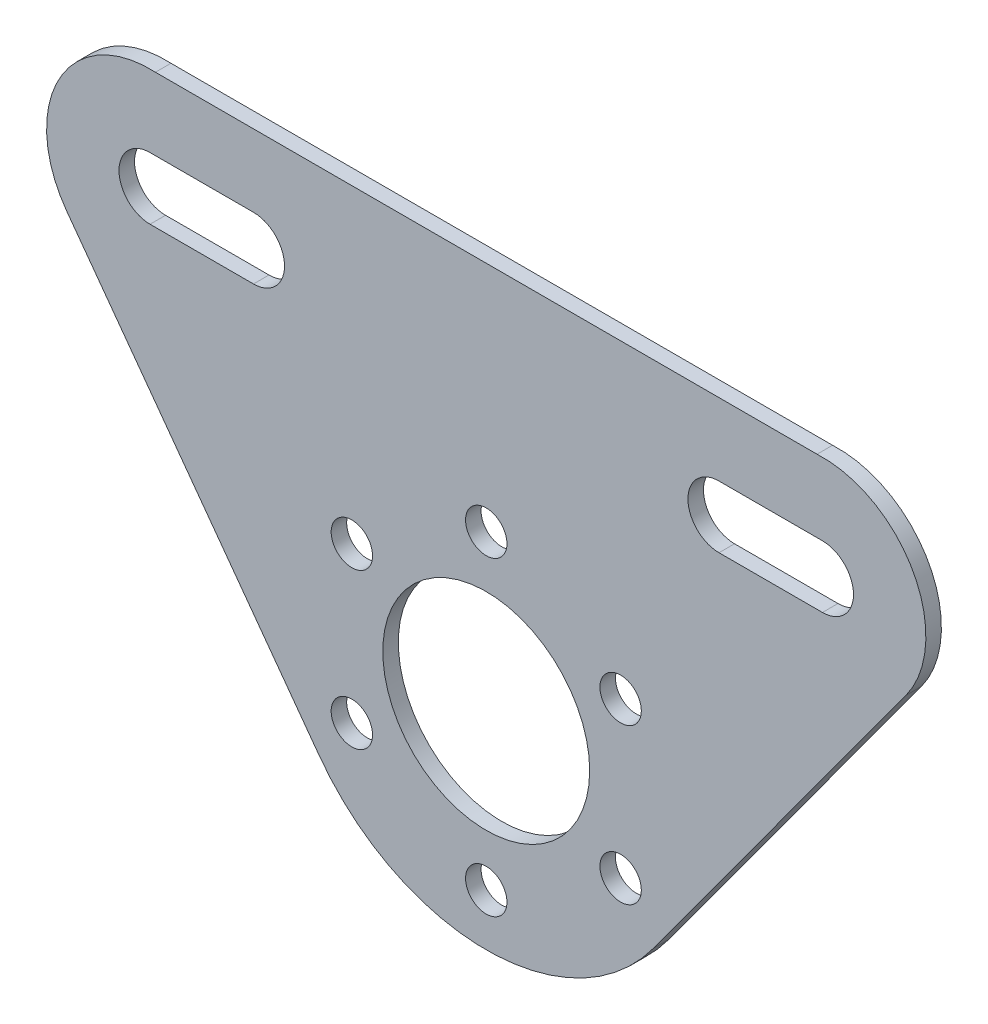
ISO-10303-21;
HEADER;
FILE_DESCRIPTION(('STEP AP214'),'2;1');
FILE_NAME('part.step','',(''),(''),'','','');
FILE_SCHEMA(('AUTOMOTIVE_DESIGN { 1 0 10303 214 1 1 1 1 }'));
ENDSEC;
DATA;
#1=APPLICATION_CONTEXT('core data for automotive mechanical design processes');
#2=APPLICATION_PROTOCOL_DEFINITION('international standard','automotive_design',2000,#1);
#3=PRODUCT_CONTEXT('',#1,'mechanical');
#4=PRODUCT('Part','Part','',(#3));
#5=PRODUCT_RELATED_PRODUCT_CATEGORY('part','',(#4));
#6=PRODUCT_DEFINITION_FORMATION('','',#4);
#7=PRODUCT_DEFINITION_CONTEXT('part definition',#1,'design');
#8=PRODUCT_DEFINITION('design','',#6,#7);
#9=PRODUCT_DEFINITION_SHAPE('','',#8);
#10=(LENGTH_UNIT() NAMED_UNIT(*) SI_UNIT(.MILLI.,.METRE.));
#11=(NAMED_UNIT(*) PLANE_ANGLE_UNIT() SI_UNIT($,.RADIAN.));
#12=(NAMED_UNIT(*) SI_UNIT($,.STERADIAN.) SOLID_ANGLE_UNIT());
#13=UNCERTAINTY_MEASURE_WITH_UNIT(LENGTH_MEASURE(1.E-05),#10,'distance_accuracy_value','');
#14=(GEOMETRIC_REPRESENTATION_CONTEXT(3) GLOBAL_UNCERTAINTY_ASSIGNED_CONTEXT((#13)) GLOBAL_UNIT_ASSIGNED_CONTEXT((#10,
#11,#12)) REPRESENTATION_CONTEXT('',''));
#15=CARTESIAN_POINT('',(0.,0.,0.));
#16=DIRECTION('',(0.,0.,1.));
#17=DIRECTION('',(1.,0.,0.));
#18=AXIS2_PLACEMENT_3D('',#15,#16,#17);
#19=CARTESIAN_POINT('',(-65.,95.,3.));
#20=DIRECTION('',(0.,0.,-1.));
#21=DIRECTION('',(-1.,0.,0.));
#22=AXIS2_PLACEMENT_3D('',#19,#20,#21);
#23=PLANE('',#22);
#24=CARTESIAN_POINT('',(-65.,95.,3.));
#25=DIRECTION('',(0.,0.,1.));
#26=DIRECTION('',(1.,0.,0.));
#27=AXIS2_PLACEMENT_3D('',#24,#25,#26);
#28=CIRCLE('',#27,5.99999999999998);
#29=CARTESIAN_POINT('',(-65.,101.,3.));
#30=VERTEX_POINT('',#29);
#31=CARTESIAN_POINT('',(-65.,89.,3.));
#32=VERTEX_POINT('',#31);
#33=EDGE_CURVE('E192',#30,#32,#28,.T.);
#34=ORIENTED_EDGE('',*,*,#33,.F.);
#35=DIRECTION('',(-1.,0.,0.));
#36=VECTOR('',#35,1.);
#37=CARTESIAN_POINT('',(-65.,101.,3.));
#38=LINE('',#37,#36);
#39=CARTESIAN_POINT('',(-45.,101.,3.));
#40=VERTEX_POINT('',#39);
#41=EDGE_CURVE('E203',#40,#30,#38,.T.);
#42=ORIENTED_EDGE('',*,*,#41,.F.);
#43=CARTESIAN_POINT('',(-45.,95.,3.));
#44=DIRECTION('',(0.,0.,1.));
#45=DIRECTION('',(1.,0.,0.));
#46=AXIS2_PLACEMENT_3D('',#43,#44,#45);
#47=CIRCLE('',#46,6.00000000000001);
#48=CARTESIAN_POINT('',(-45.,89.,3.));
#49=VERTEX_POINT('',#48);
#50=EDGE_CURVE('E199',#49,#40,#47,.T.);
#51=ORIENTED_EDGE('',*,*,#50,.F.);
#52=DIRECTION('',(1.,0.,0.));
#53=VECTOR('',#52,1.);
#54=CARTESIAN_POINT('',(-65.,89.,3.));
#55=LINE('',#54,#53);
#56=EDGE_CURVE('E195',#32,#49,#55,.T.);
#57=ORIENTED_EDGE('',*,*,#56,.F.);
#58=EDGE_LOOP('',(#34,#42,#51,#57));
#59=FACE_BOUND('',#58,.T.);
#60=CARTESIAN_POINT('',(-65.,95.,3.));
#61=DIRECTION('',(0.,0.,1.));
#62=DIRECTION('',(-1.,0.,0.));
#63=AXIS2_PLACEMENT_3D('',#60,#61,#62);
#64=CIRCLE('',#63,20.);
#65=CARTESIAN_POINT('',(-63.9564503364036,114.972756547347,3.));
#66=VERTEX_POINT('',#65);
#67=CARTESIAN_POINT('',(-81.1436137192907,83.1939110590201,3.));
#68=VERTEX_POINT('',#67);
#69=EDGE_CURVE('E251',#66,#68,#64,.T.);
#70=ORIENTED_EDGE('',*,*,#69,.T.);
#71=DIRECTION('',(0.590304447048996,-0.807180685964536,0.));
#72=VECTOR('',#71,1.);
#73=CARTESIAN_POINT('',(-32.2872274385814,16.3878221180401,3.));
#74=LINE('',#73,#72);
#75=CARTESIAN_POINT('',(-32.2872274385814,16.3878221180401,3.));
#76=VERTEX_POINT('',#75);
#77=EDGE_CURVE('E255',#68,#76,#74,.T.);
#78=ORIENTED_EDGE('',*,*,#77,.T.);
#79=CARTESIAN_POINT('',(0.,40.,3.));
#80=DIRECTION('',(0.,0.,1.));
#81=DIRECTION('',(1.,0.,0.));
#82=AXIS2_PLACEMENT_3D('',#79,#80,#81);
#83=CIRCLE('',#82,40.);
#84=CARTESIAN_POINT('',(32.2872274385814,16.3878221180401,3.));
#85=VERTEX_POINT('',#84);
#86=EDGE_CURVE('E259',#76,#85,#83,.T.);
#87=ORIENTED_EDGE('',*,*,#86,.T.);
#88=DIRECTION('',(0.590304447048996,0.807180685964536,0.));
#89=VECTOR('',#88,1.);
#90=CARTESIAN_POINT('',(32.2872274385814,16.3878221180401,3.));
#91=LINE('',#90,#89);
#92=CARTESIAN_POINT('',(81.1436137192907,83.1939110590201,3.));
#93=VERTEX_POINT('',#92);
#94=EDGE_CURVE('E262',#85,#93,#91,.T.);
#95=ORIENTED_EDGE('',*,*,#94,.T.);
#96=CARTESIAN_POINT('',(65.,95.,3.));
#97=DIRECTION('',(0.,0.,1.));
#98=DIRECTION('',(1.,0.,0.));
#99=AXIS2_PLACEMENT_3D('',#96,#97,#98);
#100=CIRCLE('',#99,20.);
#101=CARTESIAN_POINT('',(63.9564503364036,114.972756547347,3.));
#102=VERTEX_POINT('',#101);
#103=EDGE_CURVE('E265',#93,#102,#100,.T.);
#104=ORIENTED_EDGE('',*,*,#103,.T.);
#105=DIRECTION('',(-1.,0.,0.));
#106=VECTOR('',#105,1.);
#107=CARTESIAN_POINT('',(-63.9564503364036,114.972756547347,3.));
#108=LINE('',#107,#106);
#109=EDGE_CURVE('E268',#102,#66,#108,.T.);
#110=ORIENTED_EDGE('',*,*,#109,.T.);
#111=EDGE_LOOP('',(#70,#78,#87,#95,#104,#110));
#112=FACE_BOUND('',#111,.T.);
#113=CARTESIAN_POINT('',(0.,40.,3.));
#114=DIRECTION('',(0.,0.,1.));
#115=DIRECTION('',(1.,0.,0.));
#116=AXIS2_PLACEMENT_3D('',#113,#114,#115);
#117=CIRCLE('',#116,20.);
#118=CARTESIAN_POINT('',(20.,40.,3.));
#119=VERTEX_POINT('',#118);
#120=EDGE_CURVE('E243',#119,#119,#117,.T.);
#121=ORIENTED_EDGE('',*,*,#120,.F.);
#122=EDGE_LOOP('',(#121));
#123=FACE_BOUND('',#122,.T.);
#124=CARTESIAN_POINT('',(0.,70.,3.));
#125=DIRECTION('',(0.,0.,1.));
#126=DIRECTION('',(1.,0.,0.));
#127=AXIS2_PLACEMENT_3D('',#124,#125,#126);
#128=CIRCLE('',#127,4.00000000000001);
#129=CARTESIAN_POINT('',(4.00000000000001,70.,3.));
#130=VERTEX_POINT('',#129);
#131=EDGE_CURVE('E235',#130,#130,#128,.T.);
#132=ORIENTED_EDGE('',*,*,#131,.F.);
#133=EDGE_LOOP('',(#132));
#134=FACE_BOUND('',#133,.T.);
#135=CARTESIAN_POINT('',(65.,95.,3.));
#136=DIRECTION('',(0.,0.,1.));
#137=DIRECTION('',(-1.,0.,0.));
#138=AXIS2_PLACEMENT_3D('',#135,#136,#137);
#139=CIRCLE('',#138,5.99999999999998);
#140=CARTESIAN_POINT('',(65.,89.,3.));
#141=VERTEX_POINT('',#140);
#142=CARTESIAN_POINT('',(65.,101.,3.));
#143=VERTEX_POINT('',#142);
#144=EDGE_CURVE('E141',#141,#143,#139,.T.);
#145=ORIENTED_EDGE('',*,*,#144,.F.);
#146=DIRECTION('',(1.,0.,0.));
#147=VECTOR('',#146,1.);
#148=CARTESIAN_POINT('',(65.,89.,3.));
#149=LINE('',#148,#147);
#150=CARTESIAN_POINT('',(45.,89.,3.));
#151=VERTEX_POINT('',#150);
#152=EDGE_CURVE('E168',#151,#141,#149,.T.);
#153=ORIENTED_EDGE('',*,*,#152,.F.);
#154=CARTESIAN_POINT('',(45.,95.,3.));
#155=DIRECTION('',(0.,0.,1.));
#156=DIRECTION('',(-1.,0.,0.));
#157=AXIS2_PLACEMENT_3D('',#154,#155,#156);
#158=CIRCLE('',#157,6.00000000000001);
#159=CARTESIAN_POINT('',(45.,101.,3.));
#160=VERTEX_POINT('',#159);
#161=EDGE_CURVE('E164',#160,#151,#158,.T.);
#162=ORIENTED_EDGE('',*,*,#161,.F.);
#163=DIRECTION('',(-1.,0.,0.));
#164=VECTOR('',#163,1.);
#165=CARTESIAN_POINT('',(65.,101.,3.));
#166=LINE('',#165,#164);
#167=EDGE_CURVE('E150',#143,#160,#166,.T.);
#168=ORIENTED_EDGE('',*,*,#167,.F.);
#169=EDGE_LOOP('',(#145,#153,#162,#168));
#170=FACE_BOUND('',#169,.T.);
#171=CARTESIAN_POINT('',(25.9807621135332,55.,3.));
#172=DIRECTION('',(0.,0.,1.));
#173=DIRECTION('',(1.,0.,0.));
#174=AXIS2_PLACEMENT_3D('',#171,#172,#173);
#175=CIRCLE('',#174,3.99999999999999);
#176=CARTESIAN_POINT('',(29.9807621135332,55.,3.));
#177=VERTEX_POINT('',#176);
#178=EDGE_CURVE('E176',#177,#177,#175,.T.);
#179=ORIENTED_EDGE('',*,*,#178,.F.);
#180=EDGE_LOOP('',(#179));
#181=FACE_BOUND('',#180,.T.);
#182=CARTESIAN_POINT('',(25.9807621135332,25.,3.));
#183=DIRECTION('',(0.,0.,1.));
#184=DIRECTION('',(1.,0.,0.));
#185=AXIS2_PLACEMENT_3D('',#182,#183,#184);
#186=CIRCLE('',#185,4.00000000000001);
#187=CARTESIAN_POINT('',(29.9807621135332,25.,3.));
#188=VERTEX_POINT('',#187);
#189=EDGE_CURVE('E439',#188,#188,#186,.T.);
#190=ORIENTED_EDGE('',*,*,#189,.F.);
#191=EDGE_LOOP('',(#190));
#192=FACE_BOUND('',#191,.T.);
#193=CARTESIAN_POINT('',(0.,9.99999999999999,3.));
#194=DIRECTION('',(0.,0.,1.));
#195=DIRECTION('',(1.,0.,0.));
#196=AXIS2_PLACEMENT_3D('',#193,#194,#195);
#197=CIRCLE('',#196,4.);
#198=CARTESIAN_POINT('',(4.00000000000001,9.99999999999999,3.));
#199=VERTEX_POINT('',#198);
#200=EDGE_CURVE('E431',#199,#199,#197,.T.);
#201=ORIENTED_EDGE('',*,*,#200,.F.);
#202=EDGE_LOOP('',(#201));
#203=FACE_BOUND('',#202,.T.);
#204=CARTESIAN_POINT('',(-25.9807621135332,25.,3.));
#205=DIRECTION('',(0.,0.,1.));
#206=DIRECTION('',(1.,0.,0.));
#207=AXIS2_PLACEMENT_3D('',#204,#205,#206);
#208=CIRCLE('',#207,4.00000000000001);
#209=CARTESIAN_POINT('',(-21.9807621135331,25.,3.));
#210=VERTEX_POINT('',#209);
#211=EDGE_CURVE('E423',#210,#210,#208,.T.);
#212=ORIENTED_EDGE('',*,*,#211,.F.);
#213=EDGE_LOOP('',(#212));
#214=FACE_BOUND('',#213,.T.);
#215=CARTESIAN_POINT('',(-25.9807621135332,55.,3.));
#216=DIRECTION('',(0.,0.,1.));
#217=DIRECTION('',(1.,0.,0.));
#218=AXIS2_PLACEMENT_3D('',#215,#216,#217);
#219=CIRCLE('',#218,4.00000000000001);
#220=CARTESIAN_POINT('',(-21.9807621135332,55.,3.));
#221=VERTEX_POINT('',#220);
#222=EDGE_CURVE('E412',#221,#221,#219,.T.);
#223=ORIENTED_EDGE('',*,*,#222,.F.);
#224=EDGE_LOOP('',(#223));
#225=FACE_BOUND('',#224,.T.);
#226=ADVANCED_FACE('F39',(#59,#112,#123,#134,#170,#181,#192,#203,#214,#225),#23,.F.);
#227=CARTESIAN_POINT('',(-65.,95.,0.));
#228=DIRECTION('',(0.,0.,-1.));
#229=DIRECTION('',(-1.,0.,0.));
#230=AXIS2_PLACEMENT_3D('',#227,#228,#229);
#231=PLANE('',#230);
#232=CARTESIAN_POINT('',(-25.9807621135332,25.,0.));
#233=DIRECTION('',(0.,0.,1.));
#234=DIRECTION('',(1.,0.,0.));
#235=AXIS2_PLACEMENT_3D('',#232,#233,#234);
#236=CIRCLE('',#235,4.00000000000001);
#237=CARTESIAN_POINT('',(-21.9807621135331,25.,0.));
#238=VERTEX_POINT('',#237);
#239=EDGE_CURVE('E420',#238,#238,#236,.T.);
#240=ORIENTED_EDGE('',*,*,#239,.T.);
#241=EDGE_LOOP('',(#240));
#242=FACE_BOUND('',#241,.T.);
#243=CARTESIAN_POINT('',(25.9807621135332,25.,0.));
#244=DIRECTION('',(0.,0.,1.));
#245=DIRECTION('',(1.,0.,0.));
#246=AXIS2_PLACEMENT_3D('',#243,#244,#245);
#247=CIRCLE('',#246,4.00000000000001);
#248=CARTESIAN_POINT('',(29.9807621135332,25.,0.));
#249=VERTEX_POINT('',#248);
#250=EDGE_CURVE('E435',#249,#249,#247,.T.);
#251=ORIENTED_EDGE('',*,*,#250,.T.);
#252=EDGE_LOOP('',(#251));
#253=FACE_BOUND('',#252,.T.);
#254=DIRECTION('',(1.,0.,0.));
#255=VECTOR('',#254,1.);
#256=CARTESIAN_POINT('',(65.,89.,0.));
#257=LINE('',#256,#255);
#258=CARTESIAN_POINT('',(45.,89.,0.));
#259=VERTEX_POINT('',#258);
#260=CARTESIAN_POINT('',(65.,89.,0.));
#261=VERTEX_POINT('',#260);
#262=EDGE_CURVE('E151',#259,#261,#257,.T.);
#263=ORIENTED_EDGE('',*,*,#262,.T.);
#264=CARTESIAN_POINT('',(65.,95.,0.));
#265=DIRECTION('',(0.,0.,1.));
#266=DIRECTION('',(-1.,0.,0.));
#267=AXIS2_PLACEMENT_3D('',#264,#265,#266);
#268=CIRCLE('',#267,5.99999999999998);
#269=CARTESIAN_POINT('',(65.,101.,0.));
#270=VERTEX_POINT('',#269);
#271=EDGE_CURVE('E63',#261,#270,#268,.T.);
#272=ORIENTED_EDGE('',*,*,#271,.T.);
#273=DIRECTION('',(-1.,0.,0.));
#274=VECTOR('',#273,1.);
#275=CARTESIAN_POINT('',(65.,101.,0.));
#276=LINE('',#275,#274);
#277=CARTESIAN_POINT('',(45.,101.,0.));
#278=VERTEX_POINT('',#277);
#279=EDGE_CURVE('E157',#270,#278,#276,.T.);
#280=ORIENTED_EDGE('',*,*,#279,.T.);
#281=CARTESIAN_POINT('',(45.,95.,0.));
#282=DIRECTION('',(0.,0.,1.));
#283=DIRECTION('',(-1.,0.,0.));
#284=AXIS2_PLACEMENT_3D('',#281,#282,#283);
#285=CIRCLE('',#284,6.00000000000001);
#286=EDGE_CURVE('E179',#278,#259,#285,.T.);
#287=ORIENTED_EDGE('',*,*,#286,.T.);
#288=EDGE_LOOP('',(#263,#272,#280,#287));
#289=FACE_BOUND('',#288,.T.);
#290=DIRECTION('',(-1.,0.,0.));
#291=VECTOR('',#290,1.);
#292=CARTESIAN_POINT('',(-65.,101.,0.));
#293=LINE('',#292,#291);
#294=CARTESIAN_POINT('',(-45.,101.,0.));
#295=VERTEX_POINT('',#294);
#296=CARTESIAN_POINT('',(-65.,101.,0.));
#297=VERTEX_POINT('',#296);
#298=EDGE_CURVE('E196',#295,#297,#293,.T.);
#299=ORIENTED_EDGE('',*,*,#298,.T.);
#300=CARTESIAN_POINT('',(-65.,95.,0.));
#301=DIRECTION('',(0.,0.,1.));
#302=DIRECTION('',(1.,0.,0.));
#303=AXIS2_PLACEMENT_3D('',#300,#301,#302);
#304=CIRCLE('',#303,5.99999999999998);
#305=CARTESIAN_POINT('',(-65.,89.,0.));
#306=VERTEX_POINT('',#305);
#307=EDGE_CURVE('E159',#297,#306,#304,.T.);
#308=ORIENTED_EDGE('',*,*,#307,.T.);
#309=DIRECTION('',(1.,0.,0.));
#310=VECTOR('',#309,1.);
#311=CARTESIAN_POINT('',(-65.,89.,0.));
#312=LINE('',#311,#310);
#313=CARTESIAN_POINT('',(-45.,89.,0.));
#314=VERTEX_POINT('',#313);
#315=EDGE_CURVE('E210',#306,#314,#312,.T.);
#316=ORIENTED_EDGE('',*,*,#315,.T.);
#317=CARTESIAN_POINT('',(-45.,95.,0.));
#318=DIRECTION('',(0.,0.,1.));
#319=DIRECTION('',(1.,0.,0.));
#320=AXIS2_PLACEMENT_3D('',#317,#318,#319);
#321=CIRCLE('',#320,6.00000000000001);
#322=EDGE_CURVE('E214',#314,#295,#321,.T.);
#323=ORIENTED_EDGE('',*,*,#322,.T.);
#324=EDGE_LOOP('',(#299,#308,#316,#323));
#325=FACE_BOUND('',#324,.T.);
#326=CARTESIAN_POINT('',(0.,70.,0.));
#327=DIRECTION('',(0.,0.,1.));
#328=DIRECTION('',(1.,0.,0.));
#329=AXIS2_PLACEMENT_3D('',#326,#327,#328);
#330=CIRCLE('',#329,4.00000000000001);
#331=CARTESIAN_POINT('',(4.00000000000001,70.,0.));
#332=VERTEX_POINT('',#331);
#333=EDGE_CURVE('E234',#332,#332,#330,.T.);
#334=ORIENTED_EDGE('',*,*,#333,.T.);
#335=EDGE_LOOP('',(#334));
#336=FACE_BOUND('',#335,.T.);
#337=CARTESIAN_POINT('',(-65.,95.,0.));
#338=DIRECTION('',(0.,0.,1.));
#339=DIRECTION('',(-1.,0.,0.));
#340=AXIS2_PLACEMENT_3D('',#337,#338,#339);
#341=CIRCLE('',#340,20.);
#342=CARTESIAN_POINT('',(-63.9564503364036,114.972756547347,0.));
#343=VERTEX_POINT('',#342);
#344=CARTESIAN_POINT('',(-81.1436137192907,83.1939110590201,0.));
#345=VERTEX_POINT('',#344);
#346=EDGE_CURVE('E247',#343,#345,#341,.T.);
#347=ORIENTED_EDGE('',*,*,#346,.F.);
#348=DIRECTION('',(-1.,0.,0.));
#349=VECTOR('',#348,1.);
#350=CARTESIAN_POINT('',(-63.9564503364036,114.972756547347,0.));
#351=LINE('',#350,#349);
#352=CARTESIAN_POINT('',(63.9564503364036,114.972756547347,0.));
#353=VERTEX_POINT('',#352);
#354=EDGE_CURVE('E256',#353,#343,#351,.T.);
#355=ORIENTED_EDGE('',*,*,#354,.F.);
#356=CARTESIAN_POINT('',(65.,95.,0.));
#357=DIRECTION('',(0.,0.,1.));
#358=DIRECTION('',(1.,0.,0.));
#359=AXIS2_PLACEMENT_3D('',#356,#357,#358);
#360=CIRCLE('',#359,20.);
#361=CARTESIAN_POINT('',(81.1436137192907,83.1939110590201,0.));
#362=VERTEX_POINT('',#361);
#363=EDGE_CURVE('E284',#362,#353,#360,.T.);
#364=ORIENTED_EDGE('',*,*,#363,.F.);
#365=DIRECTION('',(0.590304447048996,0.807180685964536,0.));
#366=VECTOR('',#365,1.);
#367=CARTESIAN_POINT('',(32.2872274385814,16.3878221180401,0.));
#368=LINE('',#367,#366);
#369=CARTESIAN_POINT('',(32.2872274385814,16.3878221180401,0.));
#370=VERTEX_POINT('',#369);
#371=EDGE_CURVE('E281',#370,#362,#368,.T.);
#372=ORIENTED_EDGE('',*,*,#371,.F.);
#373=CARTESIAN_POINT('',(0.,40.,0.));
#374=DIRECTION('',(0.,0.,1.));
#375=DIRECTION('',(1.,0.,0.));
#376=AXIS2_PLACEMENT_3D('',#373,#374,#375);
#377=CIRCLE('',#376,40.);
#378=CARTESIAN_POINT('',(-32.2872274385814,16.3878221180401,0.));
#379=VERTEX_POINT('',#378);
#380=EDGE_CURVE('E278',#379,#370,#377,.T.);
#381=ORIENTED_EDGE('',*,*,#380,.F.);
#382=DIRECTION('',(0.590304447048996,-0.807180685964536,0.));
#383=VECTOR('',#382,1.);
#384=CARTESIAN_POINT('',(-32.2872274385814,16.3878221180401,0.));
#385=LINE('',#384,#383);
#386=EDGE_CURVE('E275',#345,#379,#385,.T.);
#387=ORIENTED_EDGE('',*,*,#386,.F.);
#388=EDGE_LOOP('',(#347,#355,#364,#372,#381,#387));
#389=FACE_BOUND('',#388,.T.);
#390=CARTESIAN_POINT('',(0.,40.,0.));
#391=DIRECTION('',(0.,0.,1.));
#392=DIRECTION('',(1.,0.,0.));
#393=AXIS2_PLACEMENT_3D('',#390,#391,#392);
#394=CIRCLE('',#393,20.);
#395=CARTESIAN_POINT('',(20.,40.,0.));
#396=VERTEX_POINT('',#395);
#397=EDGE_CURVE('E239',#396,#396,#394,.T.);
#398=ORIENTED_EDGE('',*,*,#397,.T.);
#399=EDGE_LOOP('',(#398));
#400=FACE_BOUND('',#399,.T.);
#401=CARTESIAN_POINT('',(25.9807621135332,55.,0.));
#402=DIRECTION('',(0.,0.,1.));
#403=DIRECTION('',(1.,0.,0.));
#404=AXIS2_PLACEMENT_3D('',#401,#402,#403);
#405=CIRCLE('',#404,3.99999999999999);
#406=CARTESIAN_POINT('',(29.9807621135332,55.,0.));
#407=VERTEX_POINT('',#406);
#408=EDGE_CURVE('E443',#407,#407,#405,.T.);
#409=ORIENTED_EDGE('',*,*,#408,.T.);
#410=EDGE_LOOP('',(#409));
#411=FACE_BOUND('',#410,.T.);
#412=CARTESIAN_POINT('',(0.,9.99999999999999,0.));
#413=DIRECTION('',(0.,0.,1.));
#414=DIRECTION('',(1.,0.,0.));
#415=AXIS2_PLACEMENT_3D('',#412,#413,#414);
#416=CIRCLE('',#415,4.);
#417=CARTESIAN_POINT('',(4.00000000000001,9.99999999999999,0.));
#418=VERTEX_POINT('',#417);
#419=EDGE_CURVE('E427',#418,#418,#416,.T.);
#420=ORIENTED_EDGE('',*,*,#419,.T.);
#421=EDGE_LOOP('',(#420));
#422=FACE_BOUND('',#421,.T.);
#423=CARTESIAN_POINT('',(-25.9807621135332,55.,0.));
#424=DIRECTION('',(0.,0.,1.));
#425=DIRECTION('',(1.,0.,0.));
#426=AXIS2_PLACEMENT_3D('',#423,#424,#425);
#427=CIRCLE('',#426,4.00000000000001);
#428=CARTESIAN_POINT('',(-21.9807621135332,55.,0.));
#429=VERTEX_POINT('',#428);
#430=EDGE_CURVE('E415',#429,#429,#427,.T.);
#431=ORIENTED_EDGE('',*,*,#430,.T.);
#432=EDGE_LOOP('',(#431));
#433=FACE_BOUND('',#432,.T.);
#434=ADVANCED_FACE('F315',(#242,#253,#289,#325,#336,#389,#400,#411,#422,#433),#231,.T.);
#435=CARTESIAN_POINT('',(-65.,95.,3.));
#436=DIRECTION('',(0.,0.,-1.));
#437=DIRECTION('',(-1.,0.,0.));
#438=AXIS2_PLACEMENT_3D('',#435,#436,#437);
#439=CYLINDRICAL_SURFACE('',#438,20.);
#440=ORIENTED_EDGE('',*,*,#346,.T.);
#441=DIRECTION('',(0.,0.,-1.));
#442=VECTOR('',#441,1.);
#443=CARTESIAN_POINT('',(-81.1436137192907,83.1939110590201,3.));
#444=LINE('',#443,#442);
#445=EDGE_CURVE('E11',#68,#345,#444,.T.);
#446=ORIENTED_EDGE('',*,*,#445,.F.);
#447=ORIENTED_EDGE('',*,*,#69,.F.);
#448=DIRECTION('',(0.,0.,-1.));
#449=VECTOR('',#448,1.);
#450=CARTESIAN_POINT('',(-63.9564503364036,114.972756547347,3.));
#451=LINE('',#450,#449);
#452=EDGE_CURVE('E271',#66,#343,#451,.T.);
#453=ORIENTED_EDGE('',*,*,#452,.T.);
#454=EDGE_LOOP('',(#440,#446,#447,#453));
#455=FACE_BOUND('',#454,.T.);
#456=ADVANCED_FACE('F41',(#455),#439,.T.);
#457=CARTESIAN_POINT('',(-32.2872274385814,16.3878221180401,3.));
#458=DIRECTION('',(0.807180685964536,0.590304447048996,0.));
#459=DIRECTION('',(-0.590304447048996,0.807180685964536,0.));
#460=AXIS2_PLACEMENT_3D('',#457,#458,#459);
#461=PLANE('',#460);
#462=ORIENTED_EDGE('',*,*,#386,.T.);
#463=DIRECTION('',(0.,0.,-1.));
#464=VECTOR('',#463,1.);
#465=CARTESIAN_POINT('',(-32.2872274385814,16.3878221180401,3.));
#466=LINE('',#465,#464);
#467=EDGE_CURVE('E48',#76,#379,#466,.T.);
#468=ORIENTED_EDGE('',*,*,#467,.F.);
#469=ORIENTED_EDGE('',*,*,#77,.F.);
#470=ORIENTED_EDGE('',*,*,#445,.T.);
#471=EDGE_LOOP('',(#462,#468,#469,#470));
#472=FACE_BOUND('',#471,.T.);
#473=ADVANCED_FACE('F333',(#472),#461,.F.);
#474=CARTESIAN_POINT('',(0.,40.,3.));
#475=DIRECTION('',(0.,0.,-1.));
#476=DIRECTION('',(-1.,0.,0.));
#477=AXIS2_PLACEMENT_3D('',#474,#475,#476);
#478=CYLINDRICAL_SURFACE('',#477,40.);
#479=ORIENTED_EDGE('',*,*,#380,.T.);
#480=DIRECTION('',(0.,0.,-1.));
#481=VECTOR('',#480,1.);
#482=CARTESIAN_POINT('',(32.2872274385814,16.3878221180401,3.));
#483=LINE('',#482,#481);
#484=EDGE_CURVE('E300',#85,#370,#483,.T.);
#485=ORIENTED_EDGE('',*,*,#484,.F.);
#486=ORIENTED_EDGE('',*,*,#86,.F.);
#487=ORIENTED_EDGE('',*,*,#467,.T.);
#488=EDGE_LOOP('',(#479,#485,#486,#487));
#489=FACE_BOUND('',#488,.T.);
#490=ADVANCED_FACE('F309',(#489),#478,.T.);
#491=CARTESIAN_POINT('',(32.2872274385814,16.3878221180401,3.));
#492=DIRECTION('',(-0.807180685964536,0.590304447048996,0.));
#493=DIRECTION('',(-0.590304447048996,-0.807180685964536,0.));
#494=AXIS2_PLACEMENT_3D('',#491,#492,#493);
#495=PLANE('',#494);
#496=ORIENTED_EDGE('',*,*,#371,.T.);
#497=DIRECTION('',(0.,0.,-1.));
#498=VECTOR('',#497,1.);
#499=CARTESIAN_POINT('',(81.1436137192907,83.1939110590201,3.));
#500=LINE('',#499,#498);
#501=EDGE_CURVE('E296',#93,#362,#500,.T.);
#502=ORIENTED_EDGE('',*,*,#501,.F.);
#503=ORIENTED_EDGE('',*,*,#94,.F.);
#504=ORIENTED_EDGE('',*,*,#484,.T.);
#505=EDGE_LOOP('',(#496,#502,#503,#504));
#506=FACE_BOUND('',#505,.T.);
#507=ADVANCED_FACE('F321',(#506),#495,.F.);
#508=CARTESIAN_POINT('',(65.,95.,3.));
#509=DIRECTION('',(0.,0.,-1.));
#510=DIRECTION('',(-1.,0.,0.));
#511=AXIS2_PLACEMENT_3D('',#508,#509,#510);
#512=CYLINDRICAL_SURFACE('',#511,20.);
#513=ORIENTED_EDGE('',*,*,#363,.T.);
#514=DIRECTION('',(0.,0.,-1.));
#515=VECTOR('',#514,1.);
#516=CARTESIAN_POINT('',(63.9564503364036,114.972756547347,3.));
#517=LINE('',#516,#515);
#518=EDGE_CURVE('E292',#102,#353,#517,.T.);
#519=ORIENTED_EDGE('',*,*,#518,.F.);
#520=ORIENTED_EDGE('',*,*,#103,.F.);
#521=ORIENTED_EDGE('',*,*,#501,.T.);
#522=EDGE_LOOP('',(#513,#519,#520,#521));
#523=FACE_BOUND('',#522,.T.);
#524=ADVANCED_FACE('F325',(#523),#512,.T.);
#525=CARTESIAN_POINT('',(-63.9564503364036,114.972756547347,3.));
#526=DIRECTION('',(0.,-1.,0.));
#527=DIRECTION('',(0.,0.,-1.));
#528=AXIS2_PLACEMENT_3D('',#525,#526,#527);
#529=PLANE('',#528);
#530=ORIENTED_EDGE('',*,*,#354,.T.);
#531=ORIENTED_EDGE('',*,*,#452,.F.);
#532=ORIENTED_EDGE('',*,*,#109,.F.);
#533=ORIENTED_EDGE('',*,*,#518,.T.);
#534=EDGE_LOOP('',(#530,#531,#532,#533));
#535=FACE_BOUND('',#534,.T.);
#536=ADVANCED_FACE('F336',(#535),#529,.F.);
#537=CARTESIAN_POINT('',(0.,40.,3.));
#538=DIRECTION('',(0.,0.,-1.));
#539=DIRECTION('',(-1.,0.,0.));
#540=AXIS2_PLACEMENT_3D('',#537,#538,#539);
#541=CYLINDRICAL_SURFACE('',#540,20.);
#542=ORIENTED_EDGE('',*,*,#120,.T.);
#543=EDGE_LOOP('',(#542));
#544=FACE_BOUND('',#543,.T.);
#545=ORIENTED_EDGE('',*,*,#397,.F.);
#546=EDGE_LOOP('',(#545));
#547=FACE_BOUND('',#546,.T.);
#548=ADVANCED_FACE('F338',(#544,#547),#541,.F.);
#549=CARTESIAN_POINT('',(0.,70.,3.));
#550=DIRECTION('',(0.,0.,-1.));
#551=DIRECTION('',(-1.,0.,0.));
#552=AXIS2_PLACEMENT_3D('',#549,#550,#551);
#553=CYLINDRICAL_SURFACE('',#552,4.00000000000001);
#554=ORIENTED_EDGE('',*,*,#131,.T.);
#555=EDGE_LOOP('',(#554));
#556=FACE_BOUND('',#555,.T.);
#557=ORIENTED_EDGE('',*,*,#333,.F.);
#558=EDGE_LOOP('',(#557));
#559=FACE_BOUND('',#558,.T.);
#560=ADVANCED_FACE('F344',(#556,#559),#553,.F.);
#561=CARTESIAN_POINT('',(-65.,95.,3.));
#562=DIRECTION('',(0.,0.,-1.));
#563=DIRECTION('',(-1.,0.,0.));
#564=AXIS2_PLACEMENT_3D('',#561,#562,#563);
#565=CYLINDRICAL_SURFACE('',#564,5.99999999999998);
#566=ORIENTED_EDGE('',*,*,#307,.F.);
#567=DIRECTION('',(0.,0.,-1.));
#568=VECTOR('',#567,1.);
#569=CARTESIAN_POINT('',(-65.,101.,3.));
#570=LINE('',#569,#568);
#571=EDGE_CURVE('E206',#30,#297,#570,.T.);
#572=ORIENTED_EDGE('',*,*,#571,.F.);
#573=ORIENTED_EDGE('',*,*,#33,.T.);
#574=DIRECTION('',(0.,0.,-1.));
#575=VECTOR('',#574,1.);
#576=CARTESIAN_POINT('',(-65.,89.,3.));
#577=LINE('',#576,#575);
#578=EDGE_CURVE('E230',#32,#306,#577,.T.);
#579=ORIENTED_EDGE('',*,*,#578,.T.);
#580=EDGE_LOOP('',(#566,#572,#573,#579));
#581=FACE_BOUND('',#580,.T.);
#582=ADVANCED_FACE('F360',(#581),#565,.F.);
#583=CARTESIAN_POINT('',(-65.,89.,3.));
#584=DIRECTION('',(0.,1.,0.));
#585=DIRECTION('',(-1.,0.,0.));
#586=AXIS2_PLACEMENT_3D('',#583,#584,#585);
#587=PLANE('',#586);
#588=ORIENTED_EDGE('',*,*,#315,.F.);
#589=ORIENTED_EDGE('',*,*,#578,.F.);
#590=ORIENTED_EDGE('',*,*,#56,.T.);
#591=DIRECTION('',(0.,0.,-1.));
#592=VECTOR('',#591,1.);
#593=CARTESIAN_POINT('',(-45.,89.,3.));
#594=LINE('',#593,#592);
#595=EDGE_CURVE('E227',#49,#314,#594,.T.);
#596=ORIENTED_EDGE('',*,*,#595,.T.);
#597=EDGE_LOOP('',(#588,#589,#590,#596));
#598=FACE_BOUND('',#597,.T.);
#599=ADVANCED_FACE('F364',(#598),#587,.T.);
#600=CARTESIAN_POINT('',(-45.,95.,3.));
#601=DIRECTION('',(0.,0.,-1.));
#602=DIRECTION('',(-1.,0.,0.));
#603=AXIS2_PLACEMENT_3D('',#600,#601,#602);
#604=CYLINDRICAL_SURFACE('',#603,6.00000000000001);
#605=ORIENTED_EDGE('',*,*,#322,.F.);
#606=ORIENTED_EDGE('',*,*,#595,.F.);
#607=ORIENTED_EDGE('',*,*,#50,.T.);
#608=DIRECTION('',(0.,0.,-1.));
#609=VECTOR('',#608,1.);
#610=CARTESIAN_POINT('',(-45.,101.,3.));
#611=LINE('',#610,#609);
#612=EDGE_CURVE('E224',#40,#295,#611,.T.);
#613=ORIENTED_EDGE('',*,*,#612,.T.);
#614=EDGE_LOOP('',(#605,#606,#607,#613));
#615=FACE_BOUND('',#614,.T.);
#616=ADVANCED_FACE('F368',(#615),#604,.F.);
#617=CARTESIAN_POINT('',(-65.,101.,3.));
#618=DIRECTION('',(0.,-1.,0.));
#619=DIRECTION('',(1.,0.,0.));
#620=AXIS2_PLACEMENT_3D('',#617,#618,#619);
#621=PLANE('',#620);
#622=ORIENTED_EDGE('',*,*,#298,.F.);
#623=ORIENTED_EDGE('',*,*,#612,.F.);
#624=ORIENTED_EDGE('',*,*,#41,.T.);
#625=ORIENTED_EDGE('',*,*,#571,.T.);
#626=EDGE_LOOP('',(#622,#623,#624,#625));
#627=FACE_BOUND('',#626,.T.);
#628=ADVANCED_FACE('F372',(#627),#621,.T.);
#629=CARTESIAN_POINT('',(65.,95.,3.));
#630=DIRECTION('',(0.,0.,-1.));
#631=DIRECTION('',(-1.,0.,0.));
#632=AXIS2_PLACEMENT_3D('',#629,#630,#631);
#633=CYLINDRICAL_SURFACE('',#632,5.99999999999998);
#634=ORIENTED_EDGE('',*,*,#271,.F.);
#635=DIRECTION('',(0.,0.,-1.));
#636=VECTOR('',#635,1.);
#637=CARTESIAN_POINT('',(65.,89.,3.));
#638=LINE('',#637,#636);
#639=EDGE_CURVE('E145',#141,#261,#638,.T.);
#640=ORIENTED_EDGE('',*,*,#639,.F.);
#641=ORIENTED_EDGE('',*,*,#144,.T.);
#642=DIRECTION('',(0.,0.,-1.));
#643=VECTOR('',#642,1.);
#644=CARTESIAN_POINT('',(65.,101.,3.));
#645=LINE('',#644,#643);
#646=EDGE_CURVE('E144',#143,#270,#645,.T.);
#647=ORIENTED_EDGE('',*,*,#646,.T.);
#648=EDGE_LOOP('',(#634,#640,#641,#647));
#649=FACE_BOUND('',#648,.T.);
#650=ADVANCED_FACE('F143',(#649),#633,.F.);
#651=CARTESIAN_POINT('',(65.,101.,3.));
#652=DIRECTION('',(0.,-1.,0.));
#653=DIRECTION('',(1.,0.,0.));
#654=AXIS2_PLACEMENT_3D('',#651,#652,#653);
#655=PLANE('',#654);
#656=ORIENTED_EDGE('',*,*,#279,.F.);
#657=ORIENTED_EDGE('',*,*,#646,.F.);
#658=ORIENTED_EDGE('',*,*,#167,.T.);
#659=DIRECTION('',(0.,0.,-1.));
#660=VECTOR('',#659,1.);
#661=CARTESIAN_POINT('',(45.,101.,3.));
#662=LINE('',#661,#660);
#663=EDGE_CURVE('E160',#160,#278,#662,.T.);
#664=ORIENTED_EDGE('',*,*,#663,.T.);
#665=EDGE_LOOP('',(#656,#657,#658,#664));
#666=FACE_BOUND('',#665,.T.);
#667=ADVANCED_FACE('F154',(#666),#655,.T.);
#668=CARTESIAN_POINT('',(45.,95.,3.));
#669=DIRECTION('',(0.,0.,-1.));
#670=DIRECTION('',(-1.,0.,0.));
#671=AXIS2_PLACEMENT_3D('',#668,#669,#670);
#672=CYLINDRICAL_SURFACE('',#671,6.00000000000001);
#673=ORIENTED_EDGE('',*,*,#286,.F.);
#674=ORIENTED_EDGE('',*,*,#663,.F.);
#675=ORIENTED_EDGE('',*,*,#161,.T.);
#676=DIRECTION('',(0.,0.,-1.));
#677=VECTOR('',#676,1.);
#678=CARTESIAN_POINT('',(45.,89.,3.));
#679=LINE('',#678,#677);
#680=EDGE_CURVE('E55',#151,#259,#679,.T.);
#681=ORIENTED_EDGE('',*,*,#680,.T.);
#682=EDGE_LOOP('',(#673,#674,#675,#681));
#683=FACE_BOUND('',#682,.T.);
#684=ADVANCED_FACE('F381',(#683),#672,.F.);
#685=CARTESIAN_POINT('',(65.,89.,3.));
#686=DIRECTION('',(0.,1.,0.));
#687=DIRECTION('',(-1.,0.,0.));
#688=AXIS2_PLACEMENT_3D('',#685,#686,#687);
#689=PLANE('',#688);
#690=ORIENTED_EDGE('',*,*,#262,.F.);
#691=ORIENTED_EDGE('',*,*,#680,.F.);
#692=ORIENTED_EDGE('',*,*,#152,.T.);
#693=ORIENTED_EDGE('',*,*,#639,.T.);
#694=EDGE_LOOP('',(#690,#691,#692,#693));
#695=FACE_BOUND('',#694,.T.);
#696=ADVANCED_FACE('F384',(#695),#689,.T.);
#697=CARTESIAN_POINT('',(25.9807621135332,55.,3.));
#698=DIRECTION('',(0.,0.,-1.));
#699=DIRECTION('',(-1.,0.,0.));
#700=AXIS2_PLACEMENT_3D('',#697,#698,#699);
#701=CYLINDRICAL_SURFACE('',#700,3.99999999999999);
#702=ORIENTED_EDGE('',*,*,#178,.T.);
#703=EDGE_LOOP('',(#702));
#704=FACE_BOUND('',#703,.T.);
#705=ORIENTED_EDGE('',*,*,#408,.F.);
#706=EDGE_LOOP('',(#705));
#707=FACE_BOUND('',#706,.T.);
#708=ADVANCED_FACE('F388',(#704,#707),#701,.F.);
#709=CARTESIAN_POINT('',(25.9807621135332,25.,3.));
#710=DIRECTION('',(0.,0.,-1.));
#711=DIRECTION('',(-1.,0.,0.));
#712=AXIS2_PLACEMENT_3D('',#709,#710,#711);
#713=CYLINDRICAL_SURFACE('',#712,4.00000000000001);
#714=ORIENTED_EDGE('',*,*,#189,.T.);
#715=EDGE_LOOP('',(#714));
#716=FACE_BOUND('',#715,.T.);
#717=ORIENTED_EDGE('',*,*,#250,.F.);
#718=EDGE_LOOP('',(#717));
#719=FACE_BOUND('',#718,.T.);
#720=ADVANCED_FACE('F391',(#716,#719),#713,.F.);
#721=CARTESIAN_POINT('',(0.,9.99999999999999,3.));
#722=DIRECTION('',(0.,0.,-1.));
#723=DIRECTION('',(-1.,0.,0.));
#724=AXIS2_PLACEMENT_3D('',#721,#722,#723);
#725=CYLINDRICAL_SURFACE('',#724,4.);
#726=ORIENTED_EDGE('',*,*,#200,.T.);
#727=EDGE_LOOP('',(#726));
#728=FACE_BOUND('',#727,.T.);
#729=ORIENTED_EDGE('',*,*,#419,.F.);
#730=EDGE_LOOP('',(#729));
#731=FACE_BOUND('',#730,.T.);
#732=ADVANCED_FACE('F395',(#728,#731),#725,.F.);
#733=CARTESIAN_POINT('',(-25.9807621135332,25.,3.));
#734=DIRECTION('',(0.,0.,-1.));
#735=DIRECTION('',(-1.,0.,0.));
#736=AXIS2_PLACEMENT_3D('',#733,#734,#735);
#737=CYLINDRICAL_SURFACE('',#736,4.00000000000001);
#738=ORIENTED_EDGE('',*,*,#211,.T.);
#739=EDGE_LOOP('',(#738));
#740=FACE_BOUND('',#739,.T.);
#741=ORIENTED_EDGE('',*,*,#239,.F.);
#742=EDGE_LOOP('',(#741));
#743=FACE_BOUND('',#742,.T.);
#744=ADVANCED_FACE('F399',(#740,#743),#737,.F.);
#745=CARTESIAN_POINT('',(-25.9807621135332,55.,3.));
#746=DIRECTION('',(0.,0.,-1.));
#747=DIRECTION('',(-1.,0.,0.));
#748=AXIS2_PLACEMENT_3D('',#745,#746,#747);
#749=CYLINDRICAL_SURFACE('',#748,4.00000000000001);
#750=ORIENTED_EDGE('',*,*,#222,.T.);
#751=EDGE_LOOP('',(#750));
#752=FACE_BOUND('',#751,.T.);
#753=ORIENTED_EDGE('',*,*,#430,.F.);
#754=EDGE_LOOP('',(#753));
#755=FACE_BOUND('',#754,.T.);
#756=ADVANCED_FACE('F403',(#752,#755),#749,.F.);
#757=CLOSED_SHELL('',(#226,#434,#456,#473,#490,#507,#524,#536,#548,#560,#582,#599,#616,#628,
#650,#667,#684,#696,#708,#720,#732,#744,#756));
#758=MANIFOLD_SOLID_BREP('B2',#757);
#759=ADVANCED_BREP_SHAPE_REPRESENTATION('',(#18,#758),#14);
#760=SHAPE_DEFINITION_REPRESENTATION(#9,#759);
ENDSEC;
END-ISO-10303-21;
